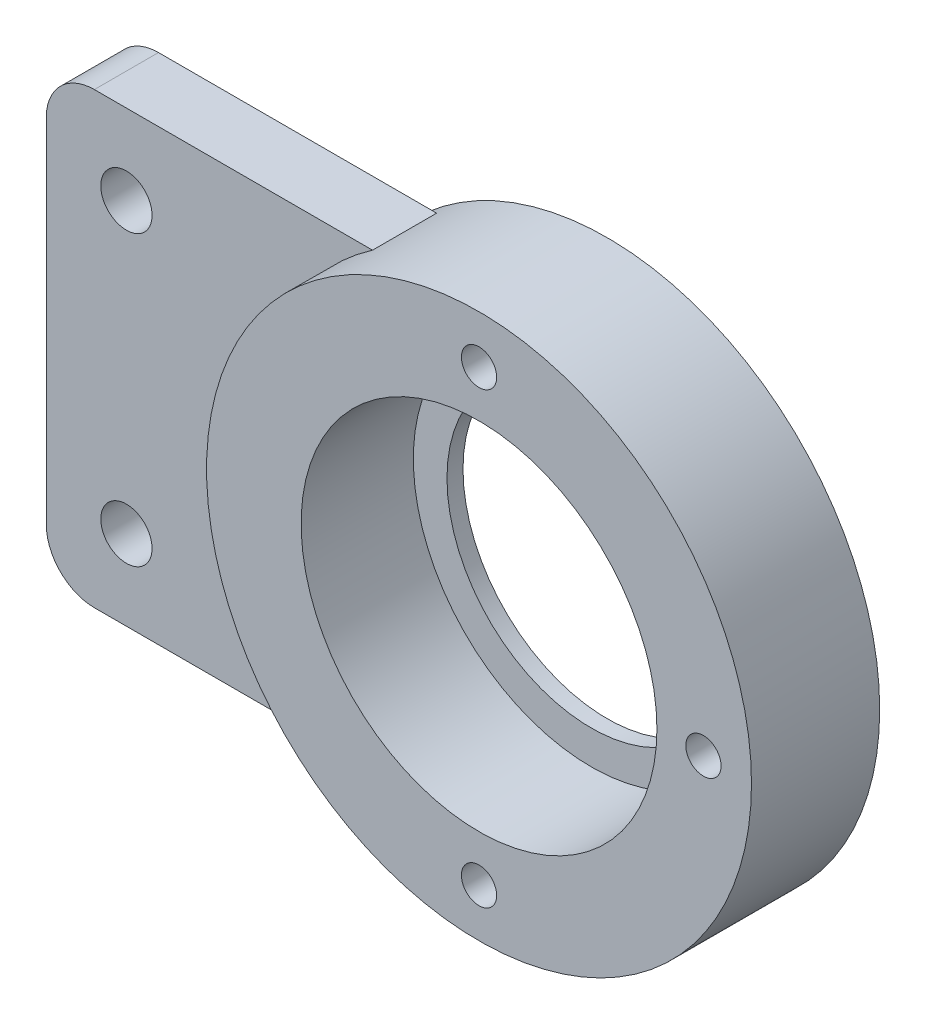
ISO-10303-21;
HEADER;
FILE_DESCRIPTION(('STEP AP214'),'2;1');
FILE_NAME('part.step','',(''),(''),'','','');
FILE_SCHEMA(('AUTOMOTIVE_DESIGN { 1 0 10303 214 1 1 1 1 }'));
ENDSEC;
DATA;
#1=APPLICATION_CONTEXT('core data for automotive mechanical design processes');
#2=APPLICATION_PROTOCOL_DEFINITION('international standard','automotive_design',2000,#1);
#3=PRODUCT_CONTEXT('',#1,'mechanical');
#4=PRODUCT('Part','Part','',(#3));
#5=PRODUCT_RELATED_PRODUCT_CATEGORY('part','',(#4));
#6=PRODUCT_DEFINITION_FORMATION('','',#4);
#7=PRODUCT_DEFINITION_CONTEXT('part definition',#1,'design');
#8=PRODUCT_DEFINITION('design','',#6,#7);
#9=PRODUCT_DEFINITION_SHAPE('','',#8);
#10=(LENGTH_UNIT() NAMED_UNIT(*) SI_UNIT(.MILLI.,.METRE.));
#11=(NAMED_UNIT(*) PLANE_ANGLE_UNIT() SI_UNIT($,.RADIAN.));
#12=(NAMED_UNIT(*) SI_UNIT($,.STERADIAN.) SOLID_ANGLE_UNIT());
#13=UNCERTAINTY_MEASURE_WITH_UNIT(LENGTH_MEASURE(1.E-05),#10,'distance_accuracy_value','');
#14=(GEOMETRIC_REPRESENTATION_CONTEXT(3) GLOBAL_UNCERTAINTY_ASSIGNED_CONTEXT((#13)) GLOBAL_UNIT_ASSIGNED_CONTEXT((#10,
#11,#12)) REPRESENTATION_CONTEXT('',''));
#15=CARTESIAN_POINT('',(0.,0.,0.));
#16=DIRECTION('',(0.,0.,1.));
#17=DIRECTION('',(1.,0.,0.));
#18=AXIS2_PLACEMENT_3D('',#15,#16,#17);
#19=CARTESIAN_POINT('',(0.,0.,0.));
#20=DIRECTION('',(0.,0.,1.));
#21=DIRECTION('',(1.,0.,0.));
#22=AXIS2_PLACEMENT_3D('',#19,#20,#21);
#23=PLANE('',#22);
#24=CARTESIAN_POINT('',(-25.,-9.,0.));
#25=DIRECTION('',(0.,0.,1.));
#26=DIRECTION('',(1.,0.,0.));
#27=AXIS2_PLACEMENT_3D('',#24,#25,#26);
#28=CIRCLE('',#27,1.6);
#29=CARTESIAN_POINT('',(-26.6,-9.,0.));
#30=VERTEX_POINT('',#29);
#31=EDGE_CURVE('E133',#30,#30,#28,.F.);
#32=ORIENTED_EDGE('',*,*,#31,.F.);
#33=EDGE_LOOP('',(#32));
#34=FACE_BOUND('',#33,.T.);
#35=CARTESIAN_POINT('',(-25.,9.,0.));
#36=DIRECTION('',(0.,0.,1.));
#37=DIRECTION('',(1.,0.,0.));
#38=AXIS2_PLACEMENT_3D('',#35,#36,#37);
#39=CIRCLE('',#38,1.6);
#40=CARTESIAN_POINT('',(-26.6,9.,0.));
#41=VERTEX_POINT('',#40);
#42=EDGE_CURVE('E129',#41,#41,#39,.F.);
#43=ORIENTED_EDGE('',*,*,#42,.F.);
#44=EDGE_LOOP('',(#43));
#45=FACE_BOUND('',#44,.T.);
#46=DIRECTION('',(1.,0.,0.));
#47=VECTOR('',#46,1.);
#48=CARTESIAN_POINT('',(-30.,-14.,0.));
#49=LINE('',#48,#47);
#50=CARTESIAN_POINT('',(-27.,-14.,0.));
#51=VERTEX_POINT('',#50);
#52=CARTESIAN_POINT('',(-9.64365076099296,-14.,0.));
#53=VERTEX_POINT('',#52);
#54=EDGE_CURVE('E92',#51,#53,#49,.T.);
#55=ORIENTED_EDGE('',*,*,#54,.F.);
#56=CARTESIAN_POINT('',(-27.,-11.,0.));
#57=DIRECTION('',(0.,0.,1.));
#58=DIRECTION('',(1.,0.,0.));
#59=AXIS2_PLACEMENT_3D('',#56,#57,#58);
#60=CIRCLE('',#59,3.);
#61=CARTESIAN_POINT('',(-30.,-11.,0.));
#62=VERTEX_POINT('',#61);
#63=EDGE_CURVE('E143',#51,#62,#60,.F.);
#64=ORIENTED_EDGE('',*,*,#63,.T.);
#65=DIRECTION('',(0.,-1.,0.));
#66=VECTOR('',#65,1.);
#67=CARTESIAN_POINT('',(-30.,-14.,0.));
#68=LINE('',#67,#66);
#69=CARTESIAN_POINT('',(-30.,11.,0.));
#70=VERTEX_POINT('',#69);
#71=EDGE_CURVE('E102',#70,#62,#68,.T.);
#72=ORIENTED_EDGE('',*,*,#71,.F.);
#73=CARTESIAN_POINT('',(-27.,11.,0.));
#74=DIRECTION('',(0.,0.,1.));
#75=DIRECTION('',(1.,0.,0.));
#76=AXIS2_PLACEMENT_3D('',#73,#74,#75);
#77=CIRCLE('',#76,3.);
#78=CARTESIAN_POINT('',(-27.,14.,0.));
#79=VERTEX_POINT('',#78);
#80=EDGE_CURVE('E119',#70,#79,#77,.F.);
#81=ORIENTED_EDGE('',*,*,#80,.T.);
#82=DIRECTION('',(-1.,0.,0.));
#83=VECTOR('',#82,1.);
#84=CARTESIAN_POINT('',(-30.,14.,0.));
#85=LINE('',#84,#83);
#86=CARTESIAN_POINT('',(-9.64365076099296,14.,0.));
#87=VERTEX_POINT('',#86);
#88=EDGE_CURVE('E104',#87,#79,#85,.T.);
#89=ORIENTED_EDGE('',*,*,#88,.F.);
#90=CARTESIAN_POINT('',(0.,0.,0.));
#91=DIRECTION('',(0.,0.,1.));
#92=DIRECTION('',(1.,0.,0.));
#93=AXIS2_PLACEMENT_3D('',#90,#91,#92);
#94=CIRCLE('',#93,17.);
#95=EDGE_CURVE('E108',#87,#53,#94,.T.);
#96=ORIENTED_EDGE('',*,*,#95,.T.);
#97=EDGE_LOOP('',(#55,#64,#72,#81,#89,#96));
#98=FACE_BOUND('',#97,.T.);
#99=ADVANCED_FACE('F39',(#34,#45,#98),#23,.F.);
#100=CARTESIAN_POINT('',(0.,0.,7.));
#101=DIRECTION('',(0.,0.,-1.));
#102=DIRECTION('',(-1.,0.,0.));
#103=AXIS2_PLACEMENT_3D('',#100,#101,#102);
#104=CYLINDRICAL_SURFACE('',#103,17.);
#105=CARTESIAN_POINT('',(0.,0.,7.));
#106=DIRECTION('',(0.,0.,1.));
#107=DIRECTION('',(1.,0.,0.));
#108=AXIS2_PLACEMENT_3D('',#105,#106,#107);
#109=CIRCLE('',#108,17.);
#110=CARTESIAN_POINT('',(17.,0.,7.));
#111=VERTEX_POINT('',#110);
#112=EDGE_CURVE('E125',#111,#111,#109,.T.);
#113=ORIENTED_EDGE('',*,*,#112,.F.);
#114=EDGE_LOOP('',(#113));
#115=FACE_BOUND('',#114,.T.);
#116=DIRECTION('',(0.,0.,-1.));
#117=VECTOR('',#116,1.);
#118=CARTESIAN_POINT('',(-9.64365076099296,-14.,7.));
#119=LINE('',#118,#117);
#120=CARTESIAN_POINT('',(-9.64365076099296,-14.,4.));
#121=VERTEX_POINT('',#120);
#122=EDGE_CURVE('E99',#53,#121,#119,.F.);
#123=ORIENTED_EDGE('',*,*,#122,.F.);
#124=ORIENTED_EDGE('',*,*,#95,.F.);
#125=DIRECTION('',(0.,0.,-1.));
#126=VECTOR('',#125,1.);
#127=CARTESIAN_POINT('',(-9.64365076099296,14.,7.));
#128=LINE('',#127,#126);
#129=CARTESIAN_POINT('',(-9.64365076099296,14.,4.));
#130=VERTEX_POINT('',#129);
#131=EDGE_CURVE('E117',#130,#87,#128,.T.);
#132=ORIENTED_EDGE('',*,*,#131,.F.);
#133=CARTESIAN_POINT('',(0.,0.,4.));
#134=DIRECTION('',(0.,0.,-1.));
#135=DIRECTION('',(-1.,0.,0.));
#136=AXIS2_PLACEMENT_3D('',#133,#134,#135);
#137=CIRCLE('',#136,17.);
#138=EDGE_CURVE('E120',#121,#130,#137,.T.);
#139=ORIENTED_EDGE('',*,*,#138,.F.);
#140=EDGE_LOOP('',(#123,#124,#132,#139));
#141=FACE_BOUND('',#140,.T.);
#142=CARTESIAN_POINT('',(0.,0.,-1.));
#143=DIRECTION('',(0.,0.,1.));
#144=DIRECTION('',(1.,0.,0.));
#145=AXIS2_PLACEMENT_3D('',#142,#143,#144);
#146=CIRCLE('',#145,17.);
#147=CARTESIAN_POINT('',(17.,0.,-1.));
#148=VERTEX_POINT('',#147);
#149=EDGE_CURVE('E111',#148,#148,#146,.T.);
#150=ORIENTED_EDGE('',*,*,#149,.T.);
#151=EDGE_LOOP('',(#150));
#152=FACE_BOUND('',#151,.T.);
#153=ADVANCED_FACE('F112',(#115,#141,#152),#104,.T.);
#154=CARTESIAN_POINT('',(0.,0.,7.));
#155=DIRECTION('',(0.,0.,-1.));
#156=DIRECTION('',(-1.,0.,0.));
#157=AXIS2_PLACEMENT_3D('',#154,#155,#156);
#158=CYLINDRICAL_SURFACE('',#157,11.1);
#159=CARTESIAN_POINT('',(0.,0.,0.));
#160=DIRECTION('',(0.,0.,1.));
#161=DIRECTION('',(1.,0.,0.));
#162=AXIS2_PLACEMENT_3D('',#159,#160,#161);
#163=CIRCLE('',#162,11.1);
#164=CARTESIAN_POINT('',(11.1,0.,0.));
#165=VERTEX_POINT('',#164);
#166=EDGE_CURVE('E169',#165,#165,#163,.T.);
#167=ORIENTED_EDGE('',*,*,#166,.F.);
#168=EDGE_LOOP('',(#167));
#169=FACE_BOUND('',#168,.T.);
#170=CARTESIAN_POINT('',(0.,0.,7.));
#171=DIRECTION('',(0.,0.,1.));
#172=DIRECTION('',(1.,0.,0.));
#173=AXIS2_PLACEMENT_3D('',#170,#171,#172);
#174=CIRCLE('',#173,11.1);
#175=CARTESIAN_POINT('',(11.1,0.,7.));
#176=VERTEX_POINT('',#175);
#177=EDGE_CURVE('E167',#176,#176,#174,.T.);
#178=ORIENTED_EDGE('',*,*,#177,.T.);
#179=EDGE_LOOP('',(#178));
#180=FACE_BOUND('',#179,.T.);
#181=ADVANCED_FACE('F181',(#169,#180),#158,.F.);
#182=CARTESIAN_POINT('',(0.,0.,7.));
#183=DIRECTION('',(0.,0.,1.));
#184=DIRECTION('',(1.,0.,0.));
#185=AXIS2_PLACEMENT_3D('',#182,#183,#184);
#186=PLANE('',#185);
#187=CARTESIAN_POINT('',(14.,0.,7.));
#188=DIRECTION('',(0.,0.,1.));
#189=DIRECTION('',(1.,0.,0.));
#190=AXIS2_PLACEMENT_3D('',#187,#188,#189);
#191=CIRCLE('',#190,1.1);
#192=CARTESIAN_POINT('',(12.9,0.,7.));
#193=VERTEX_POINT('',#192);
#194=EDGE_CURVE('E139',#193,#193,#191,.T.);
#195=ORIENTED_EDGE('',*,*,#194,.F.);
#196=EDGE_LOOP('',(#195));
#197=FACE_BOUND('',#196,.T.);
#198=CARTESIAN_POINT('',(0.,-14.,7.));
#199=DIRECTION('',(0.,0.,1.));
#200=DIRECTION('',(1.,0.,0.));
#201=AXIS2_PLACEMENT_3D('',#198,#199,#200);
#202=CIRCLE('',#201,1.1);
#203=CARTESIAN_POINT('',(-1.1,-14.,7.));
#204=VERTEX_POINT('',#203);
#205=EDGE_CURVE('E255',#204,#204,#202,.T.);
#206=ORIENTED_EDGE('',*,*,#205,.F.);
#207=EDGE_LOOP('',(#206));
#208=FACE_BOUND('',#207,.T.);
#209=CARTESIAN_POINT('',(0.,14.,7.));
#210=DIRECTION('',(0.,0.,1.));
#211=DIRECTION('',(1.,0.,0.));
#212=AXIS2_PLACEMENT_3D('',#209,#210,#211);
#213=CIRCLE('',#212,1.1);
#214=CARTESIAN_POINT('',(-1.1,14.,7.));
#215=VERTEX_POINT('',#214);
#216=EDGE_CURVE('E253',#215,#215,#213,.T.);
#217=ORIENTED_EDGE('',*,*,#216,.F.);
#218=EDGE_LOOP('',(#217));
#219=FACE_BOUND('',#218,.T.);
#220=ORIENTED_EDGE('',*,*,#112,.T.);
#221=EDGE_LOOP('',(#220));
#222=FACE_BOUND('',#221,.T.);
#223=ORIENTED_EDGE('',*,*,#177,.F.);
#224=EDGE_LOOP('',(#223));
#225=FACE_BOUND('',#224,.T.);
#226=ADVANCED_FACE('F180',(#197,#208,#219,#222,#225),#186,.T.);
#227=CARTESIAN_POINT('',(-30.,-14.,4.));
#228=DIRECTION('',(0.,1.,0.));
#229=DIRECTION('',(0.,0.,1.));
#230=AXIS2_PLACEMENT_3D('',#227,#228,#229);
#231=PLANE('',#230);
#232=DIRECTION('',(1.,0.,0.));
#233=VECTOR('',#232,1.);
#234=CARTESIAN_POINT('',(-30.,-14.,4.));
#235=LINE('',#234,#233);
#236=CARTESIAN_POINT('',(-27.,-14.,4.));
#237=VERTEX_POINT('',#236);
#238=EDGE_CURVE('E154',#237,#121,#235,.T.);
#239=ORIENTED_EDGE('',*,*,#238,.F.);
#240=DIRECTION('',(0.,0.,-1.));
#241=VECTOR('',#240,1.);
#242=CARTESIAN_POINT('',(-27.,-14.,4.));
#243=LINE('',#242,#241);
#244=EDGE_CURVE('E105',#237,#51,#243,.T.);
#245=ORIENTED_EDGE('',*,*,#244,.T.);
#246=ORIENTED_EDGE('',*,*,#54,.T.);
#247=ORIENTED_EDGE('',*,*,#122,.T.);
#248=EDGE_LOOP('',(#239,#245,#246,#247));
#249=FACE_BOUND('',#248,.T.);
#250=ADVANCED_FACE('F96',(#249),#231,.F.);
#251=CARTESIAN_POINT('',(-30.,14.,4.));
#252=DIRECTION('',(0.,-1.,0.));
#253=DIRECTION('',(0.,0.,-1.));
#254=AXIS2_PLACEMENT_3D('',#251,#252,#253);
#255=PLANE('',#254);
#256=ORIENTED_EDGE('',*,*,#88,.T.);
#257=DIRECTION('',(0.,0.,-1.));
#258=VECTOR('',#257,1.);
#259=CARTESIAN_POINT('',(-27.,14.,4.));
#260=LINE('',#259,#258);
#261=CARTESIAN_POINT('',(-27.,14.,4.));
#262=VERTEX_POINT('',#261);
#263=EDGE_CURVE('E11',#79,#262,#260,.F.);
#264=ORIENTED_EDGE('',*,*,#263,.T.);
#265=DIRECTION('',(-1.,0.,0.));
#266=VECTOR('',#265,1.);
#267=CARTESIAN_POINT('',(-30.,14.,4.));
#268=LINE('',#267,#266);
#269=EDGE_CURVE('E156',#130,#262,#268,.T.);
#270=ORIENTED_EDGE('',*,*,#269,.F.);
#271=ORIENTED_EDGE('',*,*,#131,.T.);
#272=EDGE_LOOP('',(#256,#264,#270,#271));
#273=FACE_BOUND('',#272,.T.);
#274=ADVANCED_FACE('F240',(#273),#255,.F.);
#275=CARTESIAN_POINT('',(-30.,-14.,4.));
#276=DIRECTION('',(1.,0.,0.));
#277=DIRECTION('',(0.,0.,-1.));
#278=AXIS2_PLACEMENT_3D('',#275,#276,#277);
#279=PLANE('',#278);
#280=ORIENTED_EDGE('',*,*,#71,.T.);
#281=DIRECTION('',(0.,0.,-1.));
#282=VECTOR('',#281,1.);
#283=CARTESIAN_POINT('',(-30.,-11.,4.));
#284=LINE('',#283,#282);
#285=CARTESIAN_POINT('',(-30.,-11.,4.));
#286=VERTEX_POINT('',#285);
#287=EDGE_CURVE('E58',#62,#286,#284,.F.);
#288=ORIENTED_EDGE('',*,*,#287,.T.);
#289=DIRECTION('',(0.,-1.,0.));
#290=VECTOR('',#289,1.);
#291=CARTESIAN_POINT('',(-30.,-14.,4.));
#292=LINE('',#291,#290);
#293=CARTESIAN_POINT('',(-30.,11.,4.));
#294=VERTEX_POINT('',#293);
#295=EDGE_CURVE('E158',#294,#286,#292,.T.);
#296=ORIENTED_EDGE('',*,*,#295,.F.);
#297=DIRECTION('',(0.,0.,-1.));
#298=VECTOR('',#297,1.);
#299=CARTESIAN_POINT('',(-30.,11.,4.));
#300=LINE('',#299,#298);
#301=EDGE_CURVE('E150',#294,#70,#300,.T.);
#302=ORIENTED_EDGE('',*,*,#301,.T.);
#303=EDGE_LOOP('',(#280,#288,#296,#302));
#304=FACE_BOUND('',#303,.T.);
#305=ADVANCED_FACE('F162',(#304),#279,.F.);
#306=CARTESIAN_POINT('',(0.,0.,4.));
#307=DIRECTION('',(0.,0.,-1.));
#308=DIRECTION('',(-1.,0.,0.));
#309=AXIS2_PLACEMENT_3D('',#306,#307,#308);
#310=PLANE('',#309);
#311=CARTESIAN_POINT('',(-25.,-9.,4.));
#312=DIRECTION('',(0.,0.,-1.));
#313=DIRECTION('',(-1.,0.,0.));
#314=AXIS2_PLACEMENT_3D('',#311,#312,#313);
#315=CIRCLE('',#314,1.6);
#316=CARTESIAN_POINT('',(-26.6,-9.,4.));
#317=VERTEX_POINT('',#316);
#318=EDGE_CURVE('E131',#317,#317,#315,.F.);
#319=ORIENTED_EDGE('',*,*,#318,.F.);
#320=EDGE_LOOP('',(#319));
#321=FACE_BOUND('',#320,.T.);
#322=CARTESIAN_POINT('',(-25.,9.,4.));
#323=DIRECTION('',(0.,0.,-1.));
#324=DIRECTION('',(-1.,0.,0.));
#325=AXIS2_PLACEMENT_3D('',#322,#323,#324);
#326=CIRCLE('',#325,1.6);
#327=CARTESIAN_POINT('',(-26.6,9.,4.));
#328=VERTEX_POINT('',#327);
#329=EDGE_CURVE('E128',#328,#328,#326,.F.);
#330=ORIENTED_EDGE('',*,*,#329,.F.);
#331=EDGE_LOOP('',(#330));
#332=FACE_BOUND('',#331,.T.);
#333=ORIENTED_EDGE('',*,*,#295,.T.);
#334=CARTESIAN_POINT('',(-27.,-11.,4.));
#335=DIRECTION('',(0.,0.,-1.));
#336=DIRECTION('',(-1.,0.,0.));
#337=AXIS2_PLACEMENT_3D('',#334,#335,#336);
#338=CIRCLE('',#337,3.);
#339=EDGE_CURVE('E50',#286,#237,#338,.F.);
#340=ORIENTED_EDGE('',*,*,#339,.T.);
#341=ORIENTED_EDGE('',*,*,#238,.T.);
#342=ORIENTED_EDGE('',*,*,#138,.T.);
#343=ORIENTED_EDGE('',*,*,#269,.T.);
#344=CARTESIAN_POINT('',(-27.,11.,4.));
#345=DIRECTION('',(0.,0.,-1.));
#346=DIRECTION('',(-1.,0.,0.));
#347=AXIS2_PLACEMENT_3D('',#344,#345,#346);
#348=CIRCLE('',#347,3.);
#349=EDGE_CURVE('E151',#262,#294,#348,.F.);
#350=ORIENTED_EDGE('',*,*,#349,.T.);
#351=EDGE_LOOP('',(#333,#340,#341,#342,#343,#350));
#352=FACE_BOUND('',#351,.T.);
#353=ADVANCED_FACE('F153',(#321,#332,#352),#310,.F.);
#354=CARTESIAN_POINT('',(0.,0.,0.));
#355=DIRECTION('',(0.,0.,1.));
#356=DIRECTION('',(1.,0.,0.));
#357=AXIS2_PLACEMENT_3D('',#354,#355,#356);
#358=PLANE('',#357);
#359=ORIENTED_EDGE('',*,*,#166,.T.);
#360=EDGE_LOOP('',(#359));
#361=FACE_BOUND('',#360,.T.);
#362=CARTESIAN_POINT('',(0.,0.,0.));
#363=DIRECTION('',(0.,0.,1.));
#364=DIRECTION('',(1.,0.,0.));
#365=AXIS2_PLACEMENT_3D('',#362,#363,#364);
#366=CIRCLE('',#365,9.);
#367=CARTESIAN_POINT('',(9.,0.,0.));
#368=VERTEX_POINT('',#367);
#369=EDGE_CURVE('E264',#368,#368,#366,.T.);
#370=ORIENTED_EDGE('',*,*,#369,.F.);
#371=EDGE_LOOP('',(#370));
#372=FACE_BOUND('',#371,.T.);
#373=ADVANCED_FACE('F230',(#361,#372),#358,.T.);
#374=CARTESIAN_POINT('',(0.,0.,-1.));
#375=DIRECTION('',(0.,0.,1.));
#376=DIRECTION('',(1.,0.,0.));
#377=AXIS2_PLACEMENT_3D('',#374,#375,#376);
#378=PLANE('',#377);
#379=CARTESIAN_POINT('',(14.,0.,-1.));
#380=DIRECTION('',(0.,0.,1.));
#381=DIRECTION('',(1.,0.,0.));
#382=AXIS2_PLACEMENT_3D('',#379,#380,#381);
#383=CIRCLE('',#382,1.1);
#384=CARTESIAN_POINT('',(12.9,0.,-1.));
#385=VERTEX_POINT('',#384);
#386=EDGE_CURVE('E127',#385,#385,#383,.F.);
#387=ORIENTED_EDGE('',*,*,#386,.F.);
#388=EDGE_LOOP('',(#387));
#389=FACE_BOUND('',#388,.T.);
#390=CARTESIAN_POINT('',(0.,-14.,-1.));
#391=DIRECTION('',(0.,0.,1.));
#392=DIRECTION('',(1.,0.,0.));
#393=AXIS2_PLACEMENT_3D('',#390,#391,#392);
#394=CIRCLE('',#393,1.1);
#395=CARTESIAN_POINT('',(-1.1,-14.,-1.));
#396=VERTEX_POINT('',#395);
#397=EDGE_CURVE('E136',#396,#396,#394,.F.);
#398=ORIENTED_EDGE('',*,*,#397,.F.);
#399=EDGE_LOOP('',(#398));
#400=FACE_BOUND('',#399,.T.);
#401=CARTESIAN_POINT('',(0.,14.,-1.));
#402=DIRECTION('',(0.,0.,1.));
#403=DIRECTION('',(1.,0.,0.));
#404=AXIS2_PLACEMENT_3D('',#401,#402,#403);
#405=CIRCLE('',#404,1.1);
#406=CARTESIAN_POINT('',(-1.1,14.,-1.));
#407=VERTEX_POINT('',#406);
#408=EDGE_CURVE('E134',#407,#407,#405,.F.);
#409=ORIENTED_EDGE('',*,*,#408,.F.);
#410=EDGE_LOOP('',(#409));
#411=FACE_BOUND('',#410,.T.);
#412=ORIENTED_EDGE('',*,*,#149,.F.);
#413=EDGE_LOOP('',(#412));
#414=FACE_BOUND('',#413,.T.);
#415=CARTESIAN_POINT('',(0.,0.,-1.));
#416=DIRECTION('',(0.,0.,1.));
#417=DIRECTION('',(1.,0.,0.));
#418=AXIS2_PLACEMENT_3D('',#415,#416,#417);
#419=CIRCLE('',#418,9.);
#420=CARTESIAN_POINT('',(9.,0.,-1.));
#421=VERTEX_POINT('',#420);
#422=EDGE_CURVE('E263',#421,#421,#419,.T.);
#423=ORIENTED_EDGE('',*,*,#422,.T.);
#424=EDGE_LOOP('',(#423));
#425=FACE_BOUND('',#424,.T.);
#426=ADVANCED_FACE('F227',(#389,#400,#411,#414,#425),#378,.F.);
#427=CARTESIAN_POINT('',(0.,0.,0.));
#428=DIRECTION('',(0.,0.,-1.));
#429=DIRECTION('',(-1.,0.,0.));
#430=AXIS2_PLACEMENT_3D('',#427,#428,#429);
#431=CYLINDRICAL_SURFACE('',#430,9.);
#432=ORIENTED_EDGE('',*,*,#369,.T.);
#433=EDGE_LOOP('',(#432));
#434=FACE_BOUND('',#433,.T.);
#435=ORIENTED_EDGE('',*,*,#422,.F.);
#436=EDGE_LOOP('',(#435));
#437=FACE_BOUND('',#436,.T.);
#438=ADVANCED_FACE('F221',(#434,#437),#431,.F.);
#439=CARTESIAN_POINT('',(-25.,9.,7.));
#440=DIRECTION('',(0.,0.,-1.));
#441=DIRECTION('',(-1.,0.,0.));
#442=AXIS2_PLACEMENT_3D('',#439,#440,#441);
#443=CYLINDRICAL_SURFACE('',#442,1.6);
#444=CARTESIAN_POINT('',(-26.6,9.,4.));
#445=CARTESIAN_POINT('',(-26.6,9.,3.95833333333333));
#446=CARTESIAN_POINT('',(-26.6,9.,3.91666666666667));
#447=CARTESIAN_POINT('',(-26.6,9.,3.83333333333333));
#448=CARTESIAN_POINT('',(-26.6,9.,3.79166666666667));
#449=CARTESIAN_POINT('',(-26.6,9.,3.70833333333333));
#450=CARTESIAN_POINT('',(-26.6,9.,3.66666666666667));
#451=CARTESIAN_POINT('',(-26.6,9.,3.58333333333333));
#452=CARTESIAN_POINT('',(-26.6,9.,3.54166666666667));
#453=CARTESIAN_POINT('',(-26.6,9.,3.45833333333333));
#454=CARTESIAN_POINT('',(-26.6,9.,3.41666666666667));
#455=CARTESIAN_POINT('',(-26.6,9.,3.33333333333333));
#456=CARTESIAN_POINT('',(-26.6,9.,3.29166666666667));
#457=CARTESIAN_POINT('',(-26.6,9.,3.20833333333333));
#458=CARTESIAN_POINT('',(-26.6,9.,3.16666666666667));
#459=CARTESIAN_POINT('',(-26.6,9.,3.08333333333333));
#460=CARTESIAN_POINT('',(-26.6,9.,3.04166666666667));
#461=CARTESIAN_POINT('',(-26.6,9.,2.95833333333333));
#462=CARTESIAN_POINT('',(-26.6,9.,2.91666666666667));
#463=CARTESIAN_POINT('',(-26.6,9.,2.83333333333333));
#464=CARTESIAN_POINT('',(-26.6,9.,2.79166666666667));
#465=CARTESIAN_POINT('',(-26.6,9.,2.70833333333333));
#466=CARTESIAN_POINT('',(-26.6,9.,2.66666666666667));
#467=CARTESIAN_POINT('',(-26.6,9.,2.58333333333333));
#468=CARTESIAN_POINT('',(-26.6,9.,2.54166666666667));
#469=CARTESIAN_POINT('',(-26.6,9.,2.45833333333333));
#470=CARTESIAN_POINT('',(-26.6,9.,2.41666666666667));
#471=CARTESIAN_POINT('',(-26.6,9.,2.33333333333333));
#472=CARTESIAN_POINT('',(-26.6,9.,2.29166666666667));
#473=CARTESIAN_POINT('',(-26.6,9.,2.20833333333333));
#474=CARTESIAN_POINT('',(-26.6,9.,2.16666666666667));
#475=CARTESIAN_POINT('',(-26.6,9.,2.08333333333333));
#476=CARTESIAN_POINT('',(-26.6,9.,2.04166666666667));
#477=CARTESIAN_POINT('',(-26.6,9.,1.95833333333333));
#478=CARTESIAN_POINT('',(-26.6,9.,1.91666666666667));
#479=CARTESIAN_POINT('',(-26.6,9.,1.83333333333333));
#480=CARTESIAN_POINT('',(-26.6,9.,1.79166666666667));
#481=CARTESIAN_POINT('',(-26.6,9.,1.70833333333333));
#482=CARTESIAN_POINT('',(-26.6,9.,1.66666666666667));
#483=CARTESIAN_POINT('',(-26.6,9.,1.58333333333333));
#484=CARTESIAN_POINT('',(-26.6,9.,1.54166666666667));
#485=CARTESIAN_POINT('',(-26.6,9.,1.45833333333333));
#486=CARTESIAN_POINT('',(-26.6,9.,1.41666666666667));
#487=CARTESIAN_POINT('',(-26.6,9.,1.33333333333333));
#488=CARTESIAN_POINT('',(-26.6,9.,1.29166666666667));
#489=CARTESIAN_POINT('',(-26.6,9.,1.20833333333333));
#490=CARTESIAN_POINT('',(-26.6,9.,1.16666666666667));
#491=CARTESIAN_POINT('',(-26.6,9.,1.08333333333333));
#492=CARTESIAN_POINT('',(-26.6,9.,1.04166666666667));
#493=CARTESIAN_POINT('',(-26.6,9.,0.958333333333333));
#494=CARTESIAN_POINT('',(-26.6,9.,0.916666666666667));
#495=CARTESIAN_POINT('',(-26.6,9.,0.833333333333333));
#496=CARTESIAN_POINT('',(-26.6,9.,0.791666666666667));
#497=CARTESIAN_POINT('',(-26.6,9.,0.708333333333333));
#498=CARTESIAN_POINT('',(-26.6,9.,0.666666666666666));
#499=CARTESIAN_POINT('',(-26.6,9.,0.583333333333333));
#500=CARTESIAN_POINT('',(-26.6,9.,0.541666666666666));
#501=CARTESIAN_POINT('',(-26.6,9.,0.458333333333333));
#502=CARTESIAN_POINT('',(-26.6,9.,0.416666666666666));
#503=CARTESIAN_POINT('',(-26.6,9.,0.333333333333333));
#504=CARTESIAN_POINT('',(-26.6,9.,0.291666666666666));
#505=CARTESIAN_POINT('',(-26.6,9.,0.208333333333333));
#506=CARTESIAN_POINT('',(-26.6,9.,0.166666666666666));
#507=CARTESIAN_POINT('',(-26.6,9.,0.0833333333333325));
#508=CARTESIAN_POINT('',(-26.6,9.,0.0416666666666658));
#509=CARTESIAN_POINT('',(-26.6,9.,0.));
#510=B_SPLINE_CURVE_WITH_KNOTS('',3,(#444,#445,#446,#447,#448,#449,#450,#451,#452,#453,#454,
#455,#456,#457,#458,#459,#460,#461,#462,#463,#464,#465,#466,#467,#468,#469,#470,#471,#472,#473,
#474,#475,#476,#477,#478,#479,#480,#481,#482,#483,#484,#485,#486,#487,#488,#489,#490,#491,#492,
#493,#494,#495,#496,#497,#498,#499,#500,#501,#502,#503,#504,#505,#506,#507,#508,#509),
.UNSPECIFIED.,.F.,.F.,(4,2,2,2,2,2,2,2,2,2,2,2,2,2,2,2,2,2,2,2,2,2,2,2,2,2,2,2,2,2,2,2,4),(0.,
0.125,0.25,0.375,0.5,0.625,0.75,0.875,1.,1.125,1.25,1.375,1.5,1.625,1.75,1.875,2.,2.125,2.25,
2.375,2.5,2.625,2.75,2.875,3.,3.125,3.25,3.375,3.5,3.625,3.75,3.875,4.),.UNSPECIFIED.);
#511=EDGE_CURVE('BSEAM218',#328,#41,#510,.T.);
#512=ORIENTED_EDGE('',*,*,#329,.T.);
#513=ORIENTED_EDGE('',*,*,#42,.T.);
#514=ORIENTED_EDGE('',*,*,#511,.T.);
#515=ORIENTED_EDGE('',*,*,#511,.F.);
#516=EDGE_LOOP('',(#512,#514,#513,#515));
#517=FACE_BOUND('',#516,.T.);
#518=ADVANCED_FACE('F218',(#517),#443,.F.);
#519=CARTESIAN_POINT('',(-25.,-9.,7.));
#520=DIRECTION('',(0.,0.,-1.));
#521=DIRECTION('',(-1.,0.,0.));
#522=AXIS2_PLACEMENT_3D('',#519,#520,#521);
#523=CYLINDRICAL_SURFACE('',#522,1.6);
#524=CARTESIAN_POINT('',(-26.6,-9.,4.));
#525=CARTESIAN_POINT('',(-26.6,-9.,3.95833333333333));
#526=CARTESIAN_POINT('',(-26.6,-9.,3.91666666666667));
#527=CARTESIAN_POINT('',(-26.6,-9.,3.83333333333333));
#528=CARTESIAN_POINT('',(-26.6,-9.,3.79166666666667));
#529=CARTESIAN_POINT('',(-26.6,-9.,3.70833333333333));
#530=CARTESIAN_POINT('',(-26.6,-9.,3.66666666666667));
#531=CARTESIAN_POINT('',(-26.6,-9.,3.58333333333333));
#532=CARTESIAN_POINT('',(-26.6,-9.,3.54166666666667));
#533=CARTESIAN_POINT('',(-26.6,-9.,3.45833333333333));
#534=CARTESIAN_POINT('',(-26.6,-9.,3.41666666666667));
#535=CARTESIAN_POINT('',(-26.6,-9.,3.33333333333333));
#536=CARTESIAN_POINT('',(-26.6,-9.,3.29166666666667));
#537=CARTESIAN_POINT('',(-26.6,-9.,3.20833333333333));
#538=CARTESIAN_POINT('',(-26.6,-9.,3.16666666666667));
#539=CARTESIAN_POINT('',(-26.6,-9.,3.08333333333333));
#540=CARTESIAN_POINT('',(-26.6,-9.,3.04166666666667));
#541=CARTESIAN_POINT('',(-26.6,-9.,2.95833333333333));
#542=CARTESIAN_POINT('',(-26.6,-9.,2.91666666666667));
#543=CARTESIAN_POINT('',(-26.6,-9.,2.83333333333333));
#544=CARTESIAN_POINT('',(-26.6,-9.,2.79166666666667));
#545=CARTESIAN_POINT('',(-26.6,-9.,2.70833333333333));
#546=CARTESIAN_POINT('',(-26.6,-9.,2.66666666666667));
#547=CARTESIAN_POINT('',(-26.6,-9.,2.58333333333333));
#548=CARTESIAN_POINT('',(-26.6,-9.,2.54166666666667));
#549=CARTESIAN_POINT('',(-26.6,-9.,2.45833333333333));
#550=CARTESIAN_POINT('',(-26.6,-9.,2.41666666666667));
#551=CARTESIAN_POINT('',(-26.6,-9.,2.33333333333333));
#552=CARTESIAN_POINT('',(-26.6,-9.,2.29166666666667));
#553=CARTESIAN_POINT('',(-26.6,-9.,2.20833333333333));
#554=CARTESIAN_POINT('',(-26.6,-9.,2.16666666666667));
#555=CARTESIAN_POINT('',(-26.6,-9.,2.08333333333333));
#556=CARTESIAN_POINT('',(-26.6,-9.,2.04166666666667));
#557=CARTESIAN_POINT('',(-26.6,-9.,1.95833333333333));
#558=CARTESIAN_POINT('',(-26.6,-9.,1.91666666666667));
#559=CARTESIAN_POINT('',(-26.6,-9.,1.83333333333333));
#560=CARTESIAN_POINT('',(-26.6,-9.,1.79166666666667));
#561=CARTESIAN_POINT('',(-26.6,-9.,1.70833333333333));
#562=CARTESIAN_POINT('',(-26.6,-9.,1.66666666666667));
#563=CARTESIAN_POINT('',(-26.6,-9.,1.58333333333333));
#564=CARTESIAN_POINT('',(-26.6,-9.,1.54166666666667));
#565=CARTESIAN_POINT('',(-26.6,-9.,1.45833333333333));
#566=CARTESIAN_POINT('',(-26.6,-9.,1.41666666666667));
#567=CARTESIAN_POINT('',(-26.6,-9.,1.33333333333333));
#568=CARTESIAN_POINT('',(-26.6,-9.,1.29166666666667));
#569=CARTESIAN_POINT('',(-26.6,-9.,1.20833333333333));
#570=CARTESIAN_POINT('',(-26.6,-9.,1.16666666666667));
#571=CARTESIAN_POINT('',(-26.6,-9.,1.08333333333333));
#572=CARTESIAN_POINT('',(-26.6,-9.,1.04166666666667));
#573=CARTESIAN_POINT('',(-26.6,-9.,0.958333333333333));
#574=CARTESIAN_POINT('',(-26.6,-9.,0.916666666666667));
#575=CARTESIAN_POINT('',(-26.6,-9.,0.833333333333333));
#576=CARTESIAN_POINT('',(-26.6,-9.,0.791666666666667));
#577=CARTESIAN_POINT('',(-26.6,-9.,0.708333333333333));
#578=CARTESIAN_POINT('',(-26.6,-9.,0.666666666666666));
#579=CARTESIAN_POINT('',(-26.6,-9.,0.583333333333333));
#580=CARTESIAN_POINT('',(-26.6,-9.,0.541666666666666));
#581=CARTESIAN_POINT('',(-26.6,-9.,0.458333333333333));
#582=CARTESIAN_POINT('',(-26.6,-9.,0.416666666666666));
#583=CARTESIAN_POINT('',(-26.6,-9.,0.333333333333333));
#584=CARTESIAN_POINT('',(-26.6,-9.,0.291666666666666));
#585=CARTESIAN_POINT('',(-26.6,-9.,0.208333333333333));
#586=CARTESIAN_POINT('',(-26.6,-9.,0.166666666666666));
#587=CARTESIAN_POINT('',(-26.6,-9.,0.0833333333333325));
#588=CARTESIAN_POINT('',(-26.6,-9.,0.0416666666666658));
#589=CARTESIAN_POINT('',(-26.6,-9.,0.));
#590=B_SPLINE_CURVE_WITH_KNOTS('',3,(#524,#525,#526,#527,#528,#529,#530,#531,#532,#533,#534,
#535,#536,#537,#538,#539,#540,#541,#542,#543,#544,#545,#546,#547,#548,#549,#550,#551,#552,#553,
#554,#555,#556,#557,#558,#559,#560,#561,#562,#563,#564,#565,#566,#567,#568,#569,#570,#571,#572,
#573,#574,#575,#576,#577,#578,#579,#580,#581,#582,#583,#584,#585,#586,#587,#588,#589),
.UNSPECIFIED.,.F.,.F.,(4,2,2,2,2,2,2,2,2,2,2,2,2,2,2,2,2,2,2,2,2,2,2,2,2,2,2,2,2,2,2,2,4),(0.,
0.125,0.25,0.375,0.5,0.625,0.75,0.875,1.,1.125,1.25,1.375,1.5,1.625,1.75,1.875,2.,2.125,2.25,
2.375,2.5,2.625,2.75,2.875,3.,3.125,3.25,3.375,3.5,3.625,3.75,3.875,4.),.UNSPECIFIED.);
#591=EDGE_CURVE('BSEAM212',#317,#30,#590,.T.);
#592=ORIENTED_EDGE('',*,*,#318,.T.);
#593=ORIENTED_EDGE('',*,*,#31,.T.);
#594=ORIENTED_EDGE('',*,*,#591,.T.);
#595=ORIENTED_EDGE('',*,*,#591,.F.);
#596=EDGE_LOOP('',(#592,#594,#593,#595));
#597=FACE_BOUND('',#596,.T.);
#598=ADVANCED_FACE('F212',(#597),#523,.F.);
#599=CARTESIAN_POINT('',(0.,14.,7.));
#600=DIRECTION('',(0.,0.,-1.));
#601=DIRECTION('',(-1.,0.,0.));
#602=AXIS2_PLACEMENT_3D('',#599,#600,#601);
#603=CYLINDRICAL_SURFACE('',#602,1.1);
#604=CARTESIAN_POINT('',(-1.1,14.,7.));
#605=CARTESIAN_POINT('',(-1.1,14.,6.91666666666667));
#606=CARTESIAN_POINT('',(-1.1,14.,6.83333333333333));
#607=CARTESIAN_POINT('',(-1.1,14.,6.66666666666667));
#608=CARTESIAN_POINT('',(-1.1,14.,6.58333333333333));
#609=CARTESIAN_POINT('',(-1.1,14.,6.41666666666667));
#610=CARTESIAN_POINT('',(-1.1,14.,6.33333333333333));
#611=CARTESIAN_POINT('',(-1.1,14.,6.16666666666667));
#612=CARTESIAN_POINT('',(-1.1,14.,6.08333333333333));
#613=CARTESIAN_POINT('',(-1.1,14.,5.91666666666666));
#614=CARTESIAN_POINT('',(-1.1,14.,5.83333333333333));
#615=CARTESIAN_POINT('',(-1.1,14.,5.66666666666666));
#616=CARTESIAN_POINT('',(-1.1,14.,5.58333333333333));
#617=CARTESIAN_POINT('',(-1.1,14.,5.41666666666667));
#618=CARTESIAN_POINT('',(-1.1,14.,5.33333333333333));
#619=CARTESIAN_POINT('',(-1.1,14.,5.16666666666667));
#620=CARTESIAN_POINT('',(-1.1,14.,5.08333333333333));
#621=CARTESIAN_POINT('',(-1.1,14.,4.91666666666666));
#622=CARTESIAN_POINT('',(-1.1,14.,4.83333333333333));
#623=CARTESIAN_POINT('',(-1.1,14.,4.66666666666666));
#624=CARTESIAN_POINT('',(-1.1,14.,4.58333333333333));
#625=CARTESIAN_POINT('',(-1.1,14.,4.41666666666667));
#626=CARTESIAN_POINT('',(-1.1,14.,4.33333333333333));
#627=CARTESIAN_POINT('',(-1.1,14.,4.16666666666667));
#628=CARTESIAN_POINT('',(-1.1,14.,4.08333333333333));
#629=CARTESIAN_POINT('',(-1.1,14.,3.91666666666666));
#630=CARTESIAN_POINT('',(-1.1,14.,3.83333333333333));
#631=CARTESIAN_POINT('',(-1.1,14.,3.66666666666666));
#632=CARTESIAN_POINT('',(-1.1,14.,3.58333333333333));
#633=CARTESIAN_POINT('',(-1.1,14.,3.41666666666666));
#634=CARTESIAN_POINT('',(-1.1,14.,3.33333333333333));
#635=CARTESIAN_POINT('',(-1.1,14.,3.16666666666666));
#636=CARTESIAN_POINT('',(-1.1,14.,3.08333333333333));
#637=CARTESIAN_POINT('',(-1.1,14.,2.91666666666667));
#638=CARTESIAN_POINT('',(-1.1,14.,2.83333333333333));
#639=CARTESIAN_POINT('',(-1.1,14.,2.66666666666666));
#640=CARTESIAN_POINT('',(-1.1,14.,2.58333333333333));
#641=CARTESIAN_POINT('',(-1.1,14.,2.41666666666666));
#642=CARTESIAN_POINT('',(-1.1,14.,2.33333333333333));
#643=CARTESIAN_POINT('',(-1.1,14.,2.16666666666666));
#644=CARTESIAN_POINT('',(-1.1,14.,2.08333333333333));
#645=CARTESIAN_POINT('',(-1.1,14.,1.91666666666666));
#646=CARTESIAN_POINT('',(-1.1,14.,1.83333333333333));
#647=CARTESIAN_POINT('',(-1.1,14.,1.66666666666666));
#648=CARTESIAN_POINT('',(-1.1,14.,1.58333333333333));
#649=CARTESIAN_POINT('',(-1.1,14.,1.41666666666666));
#650=CARTESIAN_POINT('',(-1.1,14.,1.33333333333333));
#651=CARTESIAN_POINT('',(-1.1,14.,1.16666666666666));
#652=CARTESIAN_POINT('',(-1.1,14.,1.08333333333333));
#653=CARTESIAN_POINT('',(-1.1,14.,0.916666666666664));
#654=CARTESIAN_POINT('',(-1.1,14.,0.833333333333331));
#655=CARTESIAN_POINT('',(-1.1,14.,0.666666666666664));
#656=CARTESIAN_POINT('',(-1.1,14.,0.58333333333333));
#657=CARTESIAN_POINT('',(-1.1,14.,0.416666666666664));
#658=CARTESIAN_POINT('',(-1.1,14.,0.33333333333333));
#659=CARTESIAN_POINT('',(-1.1,14.,0.166666666666664));
#660=CARTESIAN_POINT('',(-1.1,14.,0.0833333333333305));
#661=CARTESIAN_POINT('',(-1.1,14.,-0.083333333333336));
#662=CARTESIAN_POINT('',(-1.1,14.,-0.166666666666669));
#663=CARTESIAN_POINT('',(-1.1,14.,-0.333333333333336));
#664=CARTESIAN_POINT('',(-1.1,14.,-0.41666666666667));
#665=CARTESIAN_POINT('',(-1.1,14.,-0.583333333333336));
#666=CARTESIAN_POINT('',(-1.1,14.,-0.66666666666667));
#667=CARTESIAN_POINT('',(-1.1,14.,-0.833333333333336));
#668=CARTESIAN_POINT('',(-1.1,14.,-0.91666666666667));
#669=CARTESIAN_POINT('',(-1.1,14.,-1.));
#670=B_SPLINE_CURVE_WITH_KNOTS('',3,(#604,#605,#606,#607,#608,#609,#610,#611,#612,#613,#614,
#615,#616,#617,#618,#619,#620,#621,#622,#623,#624,#625,#626,#627,#628,#629,#630,#631,#632,#633,
#634,#635,#636,#637,#638,#639,#640,#641,#642,#643,#644,#645,#646,#647,#648,#649,#650,#651,#652,
#653,#654,#655,#656,#657,#658,#659,#660,#661,#662,#663,#664,#665,#666,#667,#668,#669),
.UNSPECIFIED.,.F.,.F.,(4,2,2,2,2,2,2,2,2,2,2,2,2,2,2,2,2,2,2,2,2,2,2,2,2,2,2,2,2,2,2,2,4),(0.,
0.25,0.5,0.750000000000001,1.,1.25,1.5,1.75,2.,2.25,2.5,2.75,3.,3.25,3.5,3.75,4.,4.25,4.5,4.75,
5.,5.25,5.5,5.75,6.,6.25,6.5,6.75,7.,7.25,7.5,7.75,8.),.UNSPECIFIED.);
#671=EDGE_CURVE('BSEAM210',#215,#407,#670,.T.);
#672=ORIENTED_EDGE('',*,*,#216,.T.);
#673=ORIENTED_EDGE('',*,*,#408,.T.);
#674=ORIENTED_EDGE('',*,*,#671,.T.);
#675=ORIENTED_EDGE('',*,*,#671,.F.);
#676=EDGE_LOOP('',(#672,#674,#673,#675));
#677=FACE_BOUND('',#676,.T.);
#678=ADVANCED_FACE('F210',(#677),#603,.F.);
#679=CARTESIAN_POINT('',(0.,-14.,7.));
#680=DIRECTION('',(0.,0.,-1.));
#681=DIRECTION('',(-1.,0.,0.));
#682=AXIS2_PLACEMENT_3D('',#679,#680,#681);
#683=CYLINDRICAL_SURFACE('',#682,1.1);
#684=CARTESIAN_POINT('',(-1.1,-14.,7.));
#685=CARTESIAN_POINT('',(-1.1,-14.,6.91666666666667));
#686=CARTESIAN_POINT('',(-1.1,-14.,6.83333333333333));
#687=CARTESIAN_POINT('',(-1.1,-14.,6.66666666666667));
#688=CARTESIAN_POINT('',(-1.1,-14.,6.58333333333333));
#689=CARTESIAN_POINT('',(-1.1,-14.,6.41666666666667));
#690=CARTESIAN_POINT('',(-1.1,-14.,6.33333333333333));
#691=CARTESIAN_POINT('',(-1.1,-14.,6.16666666666667));
#692=CARTESIAN_POINT('',(-1.1,-14.,6.08333333333333));
#693=CARTESIAN_POINT('',(-1.1,-14.,5.91666666666666));
#694=CARTESIAN_POINT('',(-1.1,-14.,5.83333333333333));
#695=CARTESIAN_POINT('',(-1.1,-14.,5.66666666666666));
#696=CARTESIAN_POINT('',(-1.1,-14.,5.58333333333333));
#697=CARTESIAN_POINT('',(-1.1,-14.,5.41666666666667));
#698=CARTESIAN_POINT('',(-1.1,-14.,5.33333333333333));
#699=CARTESIAN_POINT('',(-1.1,-14.,5.16666666666667));
#700=CARTESIAN_POINT('',(-1.1,-14.,5.08333333333333));
#701=CARTESIAN_POINT('',(-1.1,-14.,4.91666666666666));
#702=CARTESIAN_POINT('',(-1.1,-14.,4.83333333333333));
#703=CARTESIAN_POINT('',(-1.1,-14.,4.66666666666666));
#704=CARTESIAN_POINT('',(-1.1,-14.,4.58333333333333));
#705=CARTESIAN_POINT('',(-1.1,-14.,4.41666666666667));
#706=CARTESIAN_POINT('',(-1.1,-14.,4.33333333333333));
#707=CARTESIAN_POINT('',(-1.1,-14.,4.16666666666667));
#708=CARTESIAN_POINT('',(-1.1,-14.,4.08333333333333));
#709=CARTESIAN_POINT('',(-1.1,-14.,3.91666666666666));
#710=CARTESIAN_POINT('',(-1.1,-14.,3.83333333333333));
#711=CARTESIAN_POINT('',(-1.1,-14.,3.66666666666666));
#712=CARTESIAN_POINT('',(-1.1,-14.,3.58333333333333));
#713=CARTESIAN_POINT('',(-1.1,-14.,3.41666666666666));
#714=CARTESIAN_POINT('',(-1.1,-14.,3.33333333333333));
#715=CARTESIAN_POINT('',(-1.1,-14.,3.16666666666666));
#716=CARTESIAN_POINT('',(-1.1,-14.,3.08333333333333));
#717=CARTESIAN_POINT('',(-1.1,-14.,2.91666666666667));
#718=CARTESIAN_POINT('',(-1.1,-14.,2.83333333333333));
#719=CARTESIAN_POINT('',(-1.1,-14.,2.66666666666666));
#720=CARTESIAN_POINT('',(-1.1,-14.,2.58333333333333));
#721=CARTESIAN_POINT('',(-1.1,-14.,2.41666666666666));
#722=CARTESIAN_POINT('',(-1.1,-14.,2.33333333333333));
#723=CARTESIAN_POINT('',(-1.1,-14.,2.16666666666666));
#724=CARTESIAN_POINT('',(-1.1,-14.,2.08333333333333));
#725=CARTESIAN_POINT('',(-1.1,-14.,1.91666666666666));
#726=CARTESIAN_POINT('',(-1.1,-14.,1.83333333333333));
#727=CARTESIAN_POINT('',(-1.1,-14.,1.66666666666666));
#728=CARTESIAN_POINT('',(-1.1,-14.,1.58333333333333));
#729=CARTESIAN_POINT('',(-1.1,-14.,1.41666666666666));
#730=CARTESIAN_POINT('',(-1.1,-14.,1.33333333333333));
#731=CARTESIAN_POINT('',(-1.1,-14.,1.16666666666666));
#732=CARTESIAN_POINT('',(-1.1,-14.,1.08333333333333));
#733=CARTESIAN_POINT('',(-1.1,-14.,0.916666666666664));
#734=CARTESIAN_POINT('',(-1.1,-14.,0.833333333333331));
#735=CARTESIAN_POINT('',(-1.1,-14.,0.666666666666664));
#736=CARTESIAN_POINT('',(-1.1,-14.,0.58333333333333));
#737=CARTESIAN_POINT('',(-1.1,-14.,0.416666666666664));
#738=CARTESIAN_POINT('',(-1.1,-14.,0.33333333333333));
#739=CARTESIAN_POINT('',(-1.1,-14.,0.166666666666664));
#740=CARTESIAN_POINT('',(-1.1,-14.,0.0833333333333305));
#741=CARTESIAN_POINT('',(-1.1,-14.,-0.083333333333336));
#742=CARTESIAN_POINT('',(-1.1,-14.,-0.166666666666669));
#743=CARTESIAN_POINT('',(-1.1,-14.,-0.333333333333336));
#744=CARTESIAN_POINT('',(-1.1,-14.,-0.41666666666667));
#745=CARTESIAN_POINT('',(-1.1,-14.,-0.583333333333336));
#746=CARTESIAN_POINT('',(-1.1,-14.,-0.66666666666667));
#747=CARTESIAN_POINT('',(-1.1,-14.,-0.833333333333336));
#748=CARTESIAN_POINT('',(-1.1,-14.,-0.91666666666667));
#749=CARTESIAN_POINT('',(-1.1,-14.,-1.));
#750=B_SPLINE_CURVE_WITH_KNOTS('',3,(#684,#685,#686,#687,#688,#689,#690,#691,#692,#693,#694,
#695,#696,#697,#698,#699,#700,#701,#702,#703,#704,#705,#706,#707,#708,#709,#710,#711,#712,#713,
#714,#715,#716,#717,#718,#719,#720,#721,#722,#723,#724,#725,#726,#727,#728,#729,#730,#731,#732,
#733,#734,#735,#736,#737,#738,#739,#740,#741,#742,#743,#744,#745,#746,#747,#748,#749),
.UNSPECIFIED.,.F.,.F.,(4,2,2,2,2,2,2,2,2,2,2,2,2,2,2,2,2,2,2,2,2,2,2,2,2,2,2,2,2,2,2,2,4),(0.,
0.25,0.5,0.750000000000001,1.,1.25,1.5,1.75,2.,2.25,2.5,2.75,3.,3.25,3.5,3.75,4.,4.25,4.5,4.75,
5.,5.25,5.5,5.75,6.,6.25,6.5,6.75,7.,7.25,7.5,7.75,8.),.UNSPECIFIED.);
#751=EDGE_CURVE('BSEAM203',#204,#396,#750,.T.);
#752=ORIENTED_EDGE('',*,*,#205,.T.);
#753=ORIENTED_EDGE('',*,*,#397,.T.);
#754=ORIENTED_EDGE('',*,*,#751,.T.);
#755=ORIENTED_EDGE('',*,*,#751,.F.);
#756=EDGE_LOOP('',(#752,#754,#753,#755));
#757=FACE_BOUND('',#756,.T.);
#758=ADVANCED_FACE('F203',(#757),#683,.F.);
#759=CARTESIAN_POINT('',(14.,0.,7.));
#760=DIRECTION('',(0.,0.,-1.));
#761=DIRECTION('',(-1.,0.,0.));
#762=AXIS2_PLACEMENT_3D('',#759,#760,#761);
#763=CYLINDRICAL_SURFACE('',#762,1.1);
#764=CARTESIAN_POINT('',(12.9,0.,7.));
#765=CARTESIAN_POINT('',(12.9,0.,6.91666666666667));
#766=CARTESIAN_POINT('',(12.9,0.,6.83333333333333));
#767=CARTESIAN_POINT('',(12.9,0.,6.66666666666667));
#768=CARTESIAN_POINT('',(12.9,0.,6.58333333333333));
#769=CARTESIAN_POINT('',(12.9,0.,6.41666666666667));
#770=CARTESIAN_POINT('',(12.9,0.,6.33333333333333));
#771=CARTESIAN_POINT('',(12.9,0.,6.16666666666667));
#772=CARTESIAN_POINT('',(12.9,0.,6.08333333333333));
#773=CARTESIAN_POINT('',(12.9,0.,5.91666666666666));
#774=CARTESIAN_POINT('',(12.9,0.,5.83333333333333));
#775=CARTESIAN_POINT('',(12.9,0.,5.66666666666666));
#776=CARTESIAN_POINT('',(12.9,0.,5.58333333333333));
#777=CARTESIAN_POINT('',(12.9,0.,5.41666666666667));
#778=CARTESIAN_POINT('',(12.9,0.,5.33333333333333));
#779=CARTESIAN_POINT('',(12.9,0.,5.16666666666667));
#780=CARTESIAN_POINT('',(12.9,0.,5.08333333333333));
#781=CARTESIAN_POINT('',(12.9,0.,4.91666666666666));
#782=CARTESIAN_POINT('',(12.9,0.,4.83333333333333));
#783=CARTESIAN_POINT('',(12.9,0.,4.66666666666666));
#784=CARTESIAN_POINT('',(12.9,0.,4.58333333333333));
#785=CARTESIAN_POINT('',(12.9,0.,4.41666666666667));
#786=CARTESIAN_POINT('',(12.9,0.,4.33333333333333));
#787=CARTESIAN_POINT('',(12.9,0.,4.16666666666667));
#788=CARTESIAN_POINT('',(12.9,0.,4.08333333333333));
#789=CARTESIAN_POINT('',(12.9,0.,3.91666666666666));
#790=CARTESIAN_POINT('',(12.9,0.,3.83333333333333));
#791=CARTESIAN_POINT('',(12.9,0.,3.66666666666666));
#792=CARTESIAN_POINT('',(12.9,0.,3.58333333333333));
#793=CARTESIAN_POINT('',(12.9,0.,3.41666666666666));
#794=CARTESIAN_POINT('',(12.9,0.,3.33333333333333));
#795=CARTESIAN_POINT('',(12.9,0.,3.16666666666666));
#796=CARTESIAN_POINT('',(12.9,0.,3.08333333333333));
#797=CARTESIAN_POINT('',(12.9,0.,2.91666666666667));
#798=CARTESIAN_POINT('',(12.9,0.,2.83333333333333));
#799=CARTESIAN_POINT('',(12.9,0.,2.66666666666666));
#800=CARTESIAN_POINT('',(12.9,0.,2.58333333333333));
#801=CARTESIAN_POINT('',(12.9,0.,2.41666666666666));
#802=CARTESIAN_POINT('',(12.9,0.,2.33333333333333));
#803=CARTESIAN_POINT('',(12.9,0.,2.16666666666666));
#804=CARTESIAN_POINT('',(12.9,0.,2.08333333333333));
#805=CARTESIAN_POINT('',(12.9,0.,1.91666666666666));
#806=CARTESIAN_POINT('',(12.9,0.,1.83333333333333));
#807=CARTESIAN_POINT('',(12.9,0.,1.66666666666666));
#808=CARTESIAN_POINT('',(12.9,0.,1.58333333333333));
#809=CARTESIAN_POINT('',(12.9,0.,1.41666666666666));
#810=CARTESIAN_POINT('',(12.9,0.,1.33333333333333));
#811=CARTESIAN_POINT('',(12.9,0.,1.16666666666666));
#812=CARTESIAN_POINT('',(12.9,0.,1.08333333333333));
#813=CARTESIAN_POINT('',(12.9,0.,0.916666666666664));
#814=CARTESIAN_POINT('',(12.9,0.,0.833333333333331));
#815=CARTESIAN_POINT('',(12.9,0.,0.666666666666664));
#816=CARTESIAN_POINT('',(12.9,0.,0.58333333333333));
#817=CARTESIAN_POINT('',(12.9,0.,0.416666666666664));
#818=CARTESIAN_POINT('',(12.9,0.,0.33333333333333));
#819=CARTESIAN_POINT('',(12.9,0.,0.166666666666664));
#820=CARTESIAN_POINT('',(12.9,0.,0.0833333333333305));
#821=CARTESIAN_POINT('',(12.9,0.,-0.083333333333336));
#822=CARTESIAN_POINT('',(12.9,0.,-0.166666666666669));
#823=CARTESIAN_POINT('',(12.9,0.,-0.333333333333336));
#824=CARTESIAN_POINT('',(12.9,0.,-0.41666666666667));
#825=CARTESIAN_POINT('',(12.9,0.,-0.583333333333336));
#826=CARTESIAN_POINT('',(12.9,0.,-0.66666666666667));
#827=CARTESIAN_POINT('',(12.9,0.,-0.833333333333336));
#828=CARTESIAN_POINT('',(12.9,0.,-0.91666666666667));
#829=CARTESIAN_POINT('',(12.9,0.,-1.));
#830=B_SPLINE_CURVE_WITH_KNOTS('',3,(#764,#765,#766,#767,#768,#769,#770,#771,#772,#773,#774,
#775,#776,#777,#778,#779,#780,#781,#782,#783,#784,#785,#786,#787,#788,#789,#790,#791,#792,#793,
#794,#795,#796,#797,#798,#799,#800,#801,#802,#803,#804,#805,#806,#807,#808,#809,#810,#811,#812,
#813,#814,#815,#816,#817,#818,#819,#820,#821,#822,#823,#824,#825,#826,#827,#828,#829),
.UNSPECIFIED.,.F.,.F.,(4,2,2,2,2,2,2,2,2,2,2,2,2,2,2,2,2,2,2,2,2,2,2,2,2,2,2,2,2,2,2,2,4),(0.,
0.25,0.5,0.750000000000001,1.,1.25,1.5,1.75,2.,2.25,2.5,2.75,3.,3.25,3.5,3.75,4.,4.25,4.5,4.75,
5.,5.25,5.5,5.75,6.,6.25,6.5,6.75,7.,7.25,7.5,7.75,8.),.UNSPECIFIED.);
#831=EDGE_CURVE('BSEAM194',#193,#385,#830,.T.);
#832=ORIENTED_EDGE('',*,*,#194,.T.);
#833=ORIENTED_EDGE('',*,*,#386,.T.);
#834=ORIENTED_EDGE('',*,*,#831,.T.);
#835=ORIENTED_EDGE('',*,*,#831,.F.);
#836=EDGE_LOOP('',(#832,#834,#833,#835));
#837=FACE_BOUND('',#836,.T.);
#838=ADVANCED_FACE('F194',(#837),#763,.F.);
#839=CARTESIAN_POINT('',(-27.,-11.,4.));
#840=DIRECTION('',(0.,0.,-1.));
#841=DIRECTION('',(-1.,0.,0.));
#842=AXIS2_PLACEMENT_3D('',#839,#840,#841);
#843=CYLINDRICAL_SURFACE('',#842,3.);
#844=ORIENTED_EDGE('',*,*,#339,.F.);
#845=ORIENTED_EDGE('',*,*,#287,.F.);
#846=ORIENTED_EDGE('',*,*,#63,.F.);
#847=ORIENTED_EDGE('',*,*,#244,.F.);
#848=EDGE_LOOP('',(#844,#845,#846,#847));
#849=FACE_BOUND('',#848,.T.);
#850=ADVANCED_FACE('F157',(#849),#843,.T.);
#851=CARTESIAN_POINT('',(-27.,11.,4.));
#852=DIRECTION('',(0.,0.,-1.));
#853=DIRECTION('',(-1.,0.,0.));
#854=AXIS2_PLACEMENT_3D('',#851,#852,#853);
#855=CYLINDRICAL_SURFACE('',#854,3.);
#856=ORIENTED_EDGE('',*,*,#349,.F.);
#857=ORIENTED_EDGE('',*,*,#263,.F.);
#858=ORIENTED_EDGE('',*,*,#80,.F.);
#859=ORIENTED_EDGE('',*,*,#301,.F.);
#860=EDGE_LOOP('',(#856,#857,#858,#859));
#861=FACE_BOUND('',#860,.T.);
#862=ADVANCED_FACE('F41',(#861),#855,.T.);
#863=CLOSED_SHELL('',(#99,#153,#181,#226,#250,#274,#305,#353,#373,#426,#438,#518,#598,#678,#758,
#838,#850,#862));
#864=MANIFOLD_SOLID_BREP('B2',#863);
#865=ADVANCED_BREP_SHAPE_REPRESENTATION('',(#18,#864),#14);
#866=SHAPE_DEFINITION_REPRESENTATION(#9,#865);
ENDSEC;
END-ISO-10303-21;
